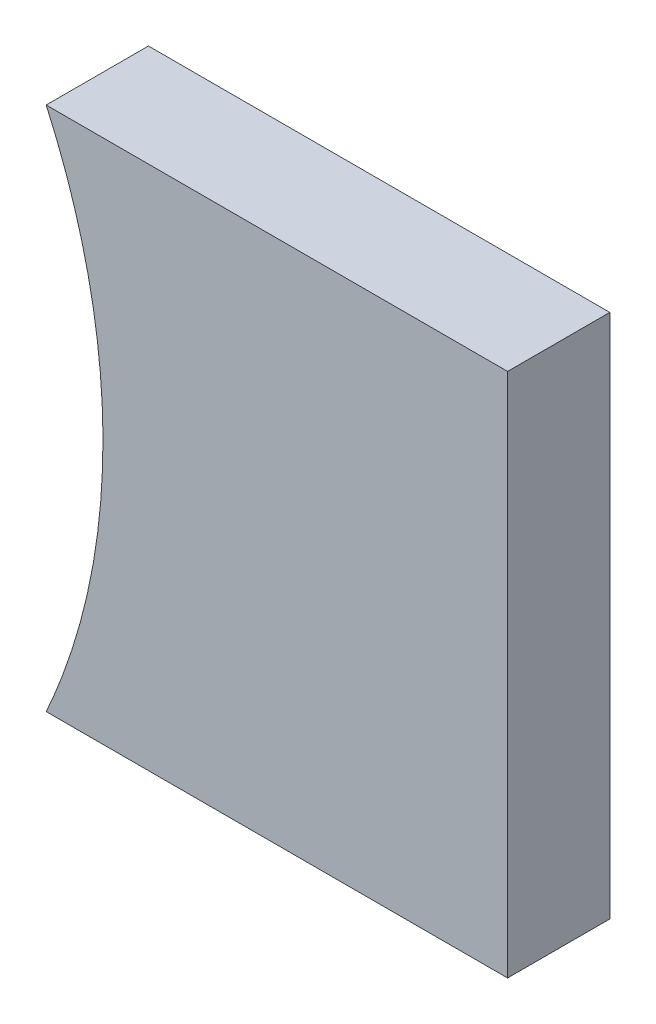
ISO-10303-21;
HEADER;
FILE_DESCRIPTION(('STEP AP214'),'2;1');
FILE_NAME('part.step','',(''),(''),'','','');
FILE_SCHEMA(('AUTOMOTIVE_DESIGN { 1 0 10303 214 1 1 1 1 }'));
ENDSEC;
DATA;
#1=APPLICATION_CONTEXT('core data for automotive mechanical design processes');
#2=APPLICATION_PROTOCOL_DEFINITION('international standard','automotive_design',2000,#1);
#3=PRODUCT_CONTEXT('',#1,'mechanical');
#4=PRODUCT('Part','Part','',(#3));
#5=PRODUCT_RELATED_PRODUCT_CATEGORY('part','',(#4));
#6=PRODUCT_DEFINITION_FORMATION('','',#4);
#7=PRODUCT_DEFINITION_CONTEXT('part definition',#1,'design');
#8=PRODUCT_DEFINITION('design','',#6,#7);
#9=PRODUCT_DEFINITION_SHAPE('','',#8);
#10=(LENGTH_UNIT() NAMED_UNIT(*) SI_UNIT(.MILLI.,.METRE.));
#11=(NAMED_UNIT(*) PLANE_ANGLE_UNIT() SI_UNIT($,.RADIAN.));
#12=(NAMED_UNIT(*) SI_UNIT($,.STERADIAN.) SOLID_ANGLE_UNIT());
#13=UNCERTAINTY_MEASURE_WITH_UNIT(LENGTH_MEASURE(1.E-05),#10,'distance_accuracy_value','');
#14=(GEOMETRIC_REPRESENTATION_CONTEXT(3) GLOBAL_UNCERTAINTY_ASSIGNED_CONTEXT((#13)) GLOBAL_UNIT_ASSIGNED_CONTEXT((#10,
#11,#12)) REPRESENTATION_CONTEXT('',''));
#15=CARTESIAN_POINT('',(0.,0.,0.));
#16=DIRECTION('',(0.,0.,1.));
#17=DIRECTION('',(1.,0.,0.));
#18=AXIS2_PLACEMENT_3D('',#15,#16,#17);
#19=CARTESIAN_POINT('',(-32.2678003350903,-15.7191742692546,-1.08278008042503));
#20=CARTESIAN_POINT('',(-31.4285731897541,-13.8690260816226,-1.08277995536382));
#21=CARTESIAN_POINT('',(-32.2678002909645,-12.018877873975,-1.082779756935));
#22=CARTESIAN_POINT('',(-32.2678003036181,-15.719174332199,-0.362780080425034));
#23=CARTESIAN_POINT('',(-31.4285731582818,-13.8690261445669,-0.362779955363821));
#24=CARTESIAN_POINT('',(-32.2678002594923,-12.0188779369194,-0.362779756935006));
#25=(BOUNDED_SURFACE() B_SPLINE_SURFACE(1,2,((#19,#20,#21),(#22,#23,#24)),.UNSPECIFIED.,.F.,.F.,
.F.) B_SPLINE_SURFACE_WITH_KNOTS((2,2),(3,3),(0.,0.160756970940836),(-0.851687216020311,
1.10567030643405E-13),
.UNSPECIFIED.) GEOMETRIC_REPRESENTATION_ITEM() RATIONAL_B_SPLINE_SURFACE(((1.,0.91069057169955,
1.),(1.,0.91069057169955,1.))) REPRESENTATION_ITEM('') SURFACE());
#26=CARTESIAN_POINT('',(-32.2678002594924,-12.0188779369189,-0.362779756935008));
#27=CARTESIAN_POINT('',(-31.4285731582818,-13.8690261445666,-0.362779955363822));
#28=CARTESIAN_POINT('',(-32.267800303618,-15.719174332199,-0.362780080425035));
#29=(BOUNDED_CURVE() B_SPLINE_CURVE(2,(#26,#27,#28),.UNSPECIFIED.,.F.,
.F.) B_SPLINE_CURVE_WITH_KNOTS((3,3),(0.,0.851687216020319),
.UNSPECIFIED.) CURVE() GEOMETRIC_REPRESENTATION_ITEM() RATIONAL_B_SPLINE_CURVE((1.,
0.910690571699561,1.)) REPRESENTATION_ITEM(''));
#30=CARTESIAN_POINT('',(-32.2678002594926,-12.018877936919,-0.362779756935007));
#31=VERTEX_POINT('',#30);
#32=CARTESIAN_POINT('',(-32.2678003036182,-15.7191743321989,-0.362780080425035));
#33=VERTEX_POINT('',#32);
#34=EDGE_CURVE('E11',#31,#33,#29,.T.);
#35=CARTESIAN_POINT('',(-32.2678002909648,-12.0188778739746,-1.082779756935));
#36=CARTESIAN_POINT('',(-32.2678002594926,-12.018877936919,-0.362779756935007));
#37=(BOUNDED_CURVE() B_SPLINE_CURVE(1,(#35,#36),.UNSPECIFIED.,.F.,
.F.) B_SPLINE_CURVE_WITH_KNOTS((2,2),(0.,0.00072),
.UNSPECIFIED.) CURVE() GEOMETRIC_REPRESENTATION_ITEM() RATIONAL_B_SPLINE_CURVE((1.,1.)) REPRESENTATION_ITEM(''));
#38=CARTESIAN_POINT('',(-32.2678002909648,-12.0188778739746,-1.082779756935));
#39=VERTEX_POINT('',#38);
#40=EDGE_CURVE('E54',#39,#31,#37,.T.);
#41=CARTESIAN_POINT('',(-32.2678003350903,-15.7191742692546,-1.08278008042503));
#42=CARTESIAN_POINT('',(-31.4285731897541,-13.8690260816223,-1.08277995536382));
#43=CARTESIAN_POINT('',(-32.2678002909647,-12.0188778739746,-1.082779756935));
#44=(BOUNDED_CURVE() B_SPLINE_CURVE(2,(#41,#42,#43),.UNSPECIFIED.,.F.,
.F.) B_SPLINE_CURVE_WITH_KNOTS((3,3),(-0.85168721602031,1.1019246816257E-13),
.UNSPECIFIED.) CURVE() GEOMETRIC_REPRESENTATION_ITEM() RATIONAL_B_SPLINE_CURVE((1.,
0.910690571699542,1.)) REPRESENTATION_ITEM(''));
#45=CARTESIAN_POINT('',(-32.2678003350904,-15.7191742692546,-1.08278008042503));
#46=VERTEX_POINT('',#45);
#47=EDGE_CURVE('E85',#46,#39,#44,.T.);
#48=CARTESIAN_POINT('',(-32.2678003036182,-15.7191743321989,-0.362780080425035));
#49=CARTESIAN_POINT('',(-32.2678003350904,-15.7191742692545,-1.08278008042503));
#50=(BOUNDED_CURVE() B_SPLINE_CURVE(1,(#48,#49),.UNSPECIFIED.,.F.,
.F.) B_SPLINE_CURVE_WITH_KNOTS((2,2),(0.,0.00072),
.UNSPECIFIED.) CURVE() GEOMETRIC_REPRESENTATION_ITEM() RATIONAL_B_SPLINE_CURVE((1.,1.)) REPRESENTATION_ITEM(''));
#51=EDGE_CURVE('E60',#33,#46,#50,.T.);
#52=ORIENTED_EDGE('',*,*,#34,.F.);
#53=ORIENTED_EDGE('',*,*,#40,.F.);
#54=ORIENTED_EDGE('',*,*,#47,.F.);
#55=ORIENTED_EDGE('',*,*,#51,.F.);
#56=EDGE_LOOP('',(#52,#53,#54,#55));
#57=FACE_BOUND('',#56,.T.);
#58=ADVANCED_FACE('F17',(#57),#25,.T.);
#59=CARTESIAN_POINT('',(-32.59280025508,-11.6488482935153,-0.362779710379796));
#60=CARTESIAN_POINT('',(-28.69280025508,-11.6488483400224,-0.362779880854296));
#61=CARTESIAN_POINT('',(-32.5928003080308,-16.0892039678514,-0.362780098567829));
#62=CARTESIAN_POINT('',(-28.6928003080307,-16.0892040143584,-0.362780269042328));
#63=(BOUNDED_SURFACE() B_SPLINE_SURFACE(1,1,((#59,#60),(#61,#62)),.UNSPECIFIED.,.F.,.F.,
.F.) B_SPLINE_SURFACE_WITH_KNOTS((2,2),(2,2),(-0.000370029639528084,0.00407032603480799),
(-0.00032500000000001,0.003575),
.UNSPECIFIED.) GEOMETRIC_REPRESENTATION_ITEM() RATIONAL_B_SPLINE_SURFACE(((1.,1.),(1.,1.))) REPRESENTATION_ITEM('') SURFACE());
#64=CARTESIAN_POINT('',(-32.2678003036182,-15.7191743321989,-0.362780080425035));
#65=CARTESIAN_POINT('',(-29.0178003036182,-15.7191743709548,-0.362780222487118));
#66=(BOUNDED_CURVE() B_SPLINE_CURVE(1,(#64,#65),.UNSPECIFIED.,.F.,
.F.) B_SPLINE_CURVE_WITH_KNOTS((2,2),(0.,0.00325),
.UNSPECIFIED.) CURVE() GEOMETRIC_REPRESENTATION_ITEM() RATIONAL_B_SPLINE_CURVE((1.,1.)) REPRESENTATION_ITEM(''));
#67=CARTESIAN_POINT('',(-29.0178003036182,-15.7191743709548,-0.362780222487118));
#68=VERTEX_POINT('',#67);
#69=EDGE_CURVE('E23',#33,#68,#66,.T.);
#70=CARTESIAN_POINT('',(-29.0178002594926,-12.0188779756748,-0.362779898997091));
#71=CARTESIAN_POINT('',(-29.0178003036182,-15.7191743709548,-0.362780222487118));
#72=(BOUNDED_CURVE() B_SPLINE_CURVE(1,(#70,#71),.UNSPECIFIED.,.F.,
.F.) B_SPLINE_CURVE_WITH_KNOTS((2,2),(0.,0.00370029639528),
.UNSPECIFIED.) CURVE() GEOMETRIC_REPRESENTATION_ITEM() RATIONAL_B_SPLINE_CURVE((1.,1.)) REPRESENTATION_ITEM(''));
#73=CARTESIAN_POINT('',(-29.0178002594926,-12.0188779756748,-0.362779898997091));
#74=VERTEX_POINT('',#73);
#75=EDGE_CURVE('E83',#74,#68,#72,.T.);
#76=CARTESIAN_POINT('',(-32.2678002594926,-12.018877936919,-0.362779756935007));
#77=CARTESIAN_POINT('',(-29.0178002594926,-12.0188779756748,-0.36277989899709));
#78=(BOUNDED_CURVE() B_SPLINE_CURVE(1,(#76,#77),.UNSPECIFIED.,.F.,
.F.) B_SPLINE_CURVE_WITH_KNOTS((2,2),(0.,0.00325),
.UNSPECIFIED.) CURVE() GEOMETRIC_REPRESENTATION_ITEM() RATIONAL_B_SPLINE_CURVE((1.,1.)) REPRESENTATION_ITEM(''));
#79=EDGE_CURVE('E115',#31,#74,#78,.T.);
#80=ORIENTED_EDGE('',*,*,#34,.T.);
#81=ORIENTED_EDGE('',*,*,#69,.T.);
#82=ORIENTED_EDGE('',*,*,#75,.F.);
#83=ORIENTED_EDGE('',*,*,#79,.F.);
#84=EDGE_LOOP('',(#80,#81,#82,#83));
#85=FACE_BOUND('',#84,.T.);
#86=ADVANCED_FACE('F19',(#85),#63,.T.);
#87=CARTESIAN_POINT('',(-32.592800300471,-15.7191743346178,-0.290780066218827));
#88=CARTESIAN_POINT('',(-28.692800300471,-15.7191743811248,-0.290780236693327));
#89=CARTESIAN_POINT('',(-32.5928003382376,-15.7191742590845,-1.15478006621882));
#90=CARTESIAN_POINT('',(-28.6928003382376,-15.7191743055915,-1.15478023669332));
#91=(BOUNDED_SURFACE() B_SPLINE_SURFACE(1,1,((#87,#88),(#89,#90)),.UNSPECIFIED.,.F.,.F.,
.F.) B_SPLINE_SURFACE_WITH_KNOTS((2,2),(2,2),(-7.2E-05,0.000792),(-0.000325000000000009,
0.003575),.UNSPECIFIED.) GEOMETRIC_REPRESENTATION_ITEM() RATIONAL_B_SPLINE_SURFACE(((1.,1.),(1.,1.))) REPRESENTATION_ITEM('') SURFACE());
#92=CARTESIAN_POINT('',(-32.2678003350904,-15.7191742692546,-1.08278008042503));
#93=CARTESIAN_POINT('',(-29.0178003350904,-15.7191743080105,-1.08278022248711));
#94=(BOUNDED_CURVE() B_SPLINE_CURVE(1,(#92,#93),.UNSPECIFIED.,.F.,
.F.) B_SPLINE_CURVE_WITH_KNOTS((2,2),(0.,0.00325),
.UNSPECIFIED.) CURVE() GEOMETRIC_REPRESENTATION_ITEM() RATIONAL_B_SPLINE_CURVE((1.,1.)) REPRESENTATION_ITEM(''));
#95=CARTESIAN_POINT('',(-29.0178003350904,-15.7191743080104,-1.08278022248711));
#96=VERTEX_POINT('',#95);
#97=EDGE_CURVE('E71',#46,#96,#94,.T.);
#98=CARTESIAN_POINT('',(-29.0178003036182,-15.7191743709548,-0.362780222487118));
#99=CARTESIAN_POINT('',(-29.0178003350904,-15.7191743080104,-1.08278022248711));
#100=(BOUNDED_CURVE() B_SPLINE_CURVE(1,(#98,#99),.UNSPECIFIED.,.F.,
.F.) B_SPLINE_CURVE_WITH_KNOTS((2,2),(0.,0.000719999999999992),
.UNSPECIFIED.) CURVE() GEOMETRIC_REPRESENTATION_ITEM() RATIONAL_B_SPLINE_CURVE((1.,1.)) REPRESENTATION_ITEM(''));
#101=EDGE_CURVE('E74',#68,#96,#100,.T.);
#102=ORIENTED_EDGE('',*,*,#51,.T.);
#103=ORIENTED_EDGE('',*,*,#97,.T.);
#104=ORIENTED_EDGE('',*,*,#101,.F.);
#105=ORIENTED_EDGE('',*,*,#69,.F.);
#106=EDGE_LOOP('',(#102,#103,#104,#105));
#107=FACE_BOUND('',#106,.T.);
#108=ADVANCED_FACE('F73',(#107),#91,.T.);
#109=CARTESIAN_POINT('',(-32.592800294112,-12.0188778638046,-1.1547797427288));
#110=CARTESIAN_POINT('',(-28.692800294112,-12.0188779103116,-1.1547799132033));
#111=CARTESIAN_POINT('',(-32.5928002563454,-12.0188779393378,-0.290779742728798));
#112=CARTESIAN_POINT('',(-28.6928002563454,-12.0188779858448,-0.290779913203298));
#113=(BOUNDED_SURFACE() B_SPLINE_SURFACE(1,1,((#109,#110),(#111,#112)),.UNSPECIFIED.,.F.,.F.,
.F.) B_SPLINE_SURFACE_WITH_KNOTS((2,2),(2,2),(-7.20000000000072E-05,0.000792),
(-0.000325000000000017,0.003575),
.UNSPECIFIED.) GEOMETRIC_REPRESENTATION_ITEM() RATIONAL_B_SPLINE_SURFACE(((1.,1.),(1.,1.))) REPRESENTATION_ITEM('') SURFACE());
#114=CARTESIAN_POINT('',(-29.0178002909648,-12.0188779127304,-1.08277989899709));
#115=CARTESIAN_POINT('',(-29.0178002594926,-12.0188779756748,-0.362779898997091));
#116=(BOUNDED_CURVE() B_SPLINE_CURVE(1,(#114,#115),.UNSPECIFIED.,.F.,
.F.) B_SPLINE_CURVE_WITH_KNOTS((2,2),(0.,0.00072),
.UNSPECIFIED.) CURVE() GEOMETRIC_REPRESENTATION_ITEM() RATIONAL_B_SPLINE_CURVE((1.,1.)) REPRESENTATION_ITEM(''));
#117=CARTESIAN_POINT('',(-29.0178002909648,-12.0188779127304,-1.08277989899709));
#118=VERTEX_POINT('',#117);
#119=EDGE_CURVE('E88',#118,#74,#116,.T.);
#120=CARTESIAN_POINT('',(-32.2678002909648,-12.0188778739746,-1.082779756935));
#121=CARTESIAN_POINT('',(-29.0178002909648,-12.0188779127304,-1.08277989899708));
#122=(BOUNDED_CURVE() B_SPLINE_CURVE(1,(#120,#121),.UNSPECIFIED.,.F.,
.F.) B_SPLINE_CURVE_WITH_KNOTS((2,2),(0.,0.00325),
.UNSPECIFIED.) CURVE() GEOMETRIC_REPRESENTATION_ITEM() RATIONAL_B_SPLINE_CURVE((1.,1.)) REPRESENTATION_ITEM(''));
#123=EDGE_CURVE('E69',#39,#118,#122,.T.);
#124=ORIENTED_EDGE('',*,*,#40,.T.);
#125=ORIENTED_EDGE('',*,*,#79,.T.);
#126=ORIENTED_EDGE('',*,*,#119,.F.);
#127=ORIENTED_EDGE('',*,*,#123,.F.);
#128=EDGE_LOOP('',(#124,#125,#126,#127));
#129=FACE_BOUND('',#128,.T.);
#130=ADVANCED_FACE('F241',(#129),#113,.T.);
#131=CARTESIAN_POINT('',(-32.592800339503,-16.0892039049071,-1.08278009856782));
#132=CARTESIAN_POINT('',(-28.6928003395029,-16.0892039514141,-1.08278026904232));
#133=CARTESIAN_POINT('',(-32.5928002865522,-11.648848230571,-1.08277971037979));
#134=CARTESIAN_POINT('',(-28.6928002865522,-11.648848277078,-1.08277988085429));
#135=(BOUNDED_SURFACE() B_SPLINE_SURFACE(1,1,((#131,#132),(#133,#134)),.UNSPECIFIED.,.F.,.F.,
.F.) B_SPLINE_SURFACE_WITH_KNOTS((2,2),(2,2),(-0.000370029639528038,0.00407032603480808),
(-0.000325,0.003575),
.UNSPECIFIED.) GEOMETRIC_REPRESENTATION_ITEM() RATIONAL_B_SPLINE_SURFACE(((1.,1.),(1.,1.))) REPRESENTATION_ITEM('') SURFACE());
#136=CARTESIAN_POINT('',(-29.0178003350904,-15.7191743080104,-1.08278022248711));
#137=CARTESIAN_POINT('',(-29.0178002909648,-12.0188779127304,-1.08277989899708));
#138=(BOUNDED_CURVE() B_SPLINE_CURVE(1,(#136,#137),.UNSPECIFIED.,.F.,
.F.) B_SPLINE_CURVE_WITH_KNOTS((2,2),(0.,0.00370029639528),
.UNSPECIFIED.) CURVE() GEOMETRIC_REPRESENTATION_ITEM() RATIONAL_B_SPLINE_CURVE((1.,1.)) REPRESENTATION_ITEM(''));
#139=EDGE_CURVE('E82',#96,#118,#138,.T.);
#140=ORIENTED_EDGE('',*,*,#47,.T.);
#141=ORIENTED_EDGE('',*,*,#123,.T.);
#142=ORIENTED_EDGE('',*,*,#139,.F.);
#143=ORIENTED_EDGE('',*,*,#97,.F.);
#144=EDGE_LOOP('',(#140,#141,#142,#143));
#145=FACE_BOUND('',#144,.T.);
#146=ADVANCED_FACE('F86',(#145),#135,.T.);
#147=CARTESIAN_POINT('',(-29.0178002519328,-11.6488483424412,-0.290779866648088));
#148=CARTESIAN_POINT('',(-29.0178002896995,-11.648848266908,-1.15477986664809));
#149=CARTESIAN_POINT('',(-29.0178003048835,-16.0892040167772,-0.290780254836121));
#150=CARTESIAN_POINT('',(-29.0178003426502,-16.089203941244,-1.15478025483612));
#151=(BOUNDED_SURFACE() B_SPLINE_SURFACE(1,1,((#147,#148),(#149,#150)),.UNSPECIFIED.,.F.,.F.,
.F.) B_SPLINE_SURFACE_WITH_KNOTS((2,2),(2,2),(-0.00222017783716803,0.00222017783716803),
(-0.000432,0.000432),
.UNSPECIFIED.) GEOMETRIC_REPRESENTATION_ITEM() RATIONAL_B_SPLINE_SURFACE(((1.,1.),(1.,1.))) REPRESENTATION_ITEM('') SURFACE());
#152=ORIENTED_EDGE('',*,*,#139,.T.);
#153=ORIENTED_EDGE('',*,*,#119,.T.);
#154=ORIENTED_EDGE('',*,*,#75,.T.);
#155=ORIENTED_EDGE('',*,*,#101,.T.);
#156=EDGE_LOOP('',(#152,#153,#154,#155));
#157=FACE_BOUND('',#156,.T.);
#158=ADVANCED_FACE('F80',(#157),#151,.T.);
#159=CLOSED_SHELL('',(#58,#86,#108,#130,#146,#158));
#160=MANIFOLD_SOLID_BREP('B1',#159);
#161=ADVANCED_BREP_SHAPE_REPRESENTATION('',(#18,#160),#14);
#162=SHAPE_DEFINITION_REPRESENTATION(#9,#161);
ENDSEC;
END-ISO-10303-21;
